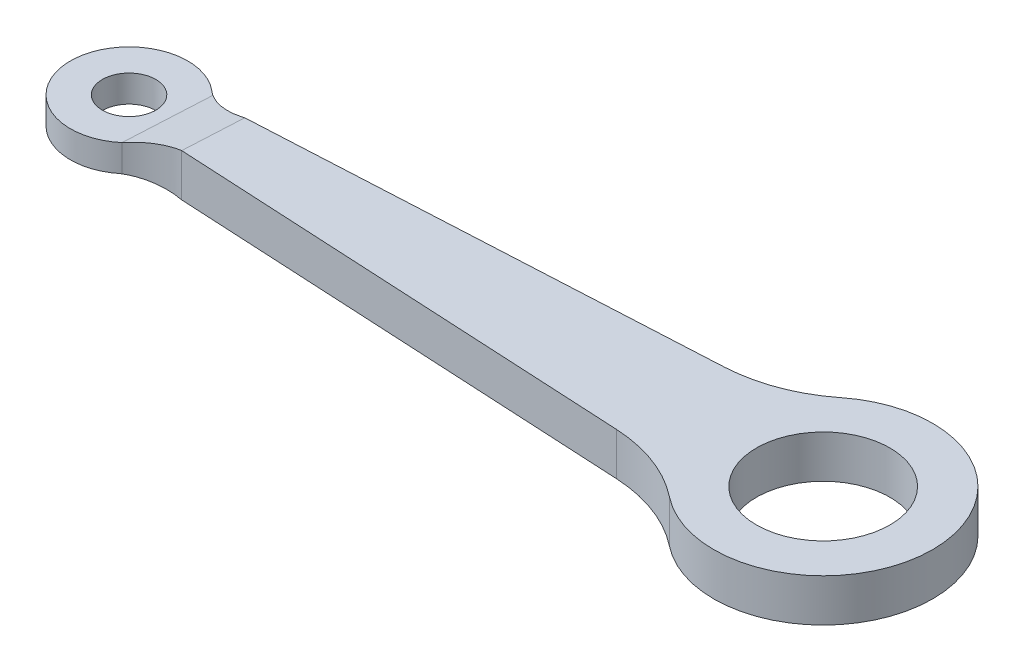
ISO-10303-21;
HEADER;
FILE_DESCRIPTION(('STEP AP214'),'2;1');
FILE_NAME('part.step','',(''),(''),'','','');
FILE_SCHEMA(('AUTOMOTIVE_DESIGN { 1 0 10303 214 1 1 1 1 }'));
ENDSEC;
DATA;
#1=APPLICATION_CONTEXT('core data for automotive mechanical design processes');
#2=APPLICATION_PROTOCOL_DEFINITION('international standard','automotive_design',2000,#1);
#3=PRODUCT_CONTEXT('',#1,'mechanical');
#4=PRODUCT('Part','Part','',(#3));
#5=PRODUCT_RELATED_PRODUCT_CATEGORY('part','',(#4));
#6=PRODUCT_DEFINITION_FORMATION('','',#4);
#7=PRODUCT_DEFINITION_CONTEXT('part definition',#1,'design');
#8=PRODUCT_DEFINITION('design','',#6,#7);
#9=PRODUCT_DEFINITION_SHAPE('','',#8);
#10=(LENGTH_UNIT() NAMED_UNIT(*) SI_UNIT(.MILLI.,.METRE.));
#11=(NAMED_UNIT(*) PLANE_ANGLE_UNIT() SI_UNIT($,.RADIAN.));
#12=(NAMED_UNIT(*) SI_UNIT($,.STERADIAN.) SOLID_ANGLE_UNIT());
#13=UNCERTAINTY_MEASURE_WITH_UNIT(LENGTH_MEASURE(1.E-05),#10,'distance_accuracy_value','');
#14=(GEOMETRIC_REPRESENTATION_CONTEXT(3) GLOBAL_UNCERTAINTY_ASSIGNED_CONTEXT((#13)) GLOBAL_UNIT_ASSIGNED_CONTEXT((#10,
#11,#12)) REPRESENTATION_CONTEXT('',''));
#15=CARTESIAN_POINT('',(0.,0.,0.));
#16=DIRECTION('',(0.,0.,1.));
#17=DIRECTION('',(1.,0.,0.));
#18=AXIS2_PLACEMENT_3D('',#15,#16,#17);
#19=CARTESIAN_POINT('',(4.70734427929749,-1.27,-5.58277852741493));
#20=DIRECTION('',(0.,1.,0.));
#21=DIRECTION('',(0.,0.,1.));
#22=AXIS2_PLACEMENT_3D('',#19,#20,#21);
#23=CYLINDRICAL_SURFACE('',#22,3.81);
#24=CARTESIAN_POINT('',(4.70734427929749,-0.80386674047041,-5.58277852741493));
#25=DIRECTION('',(0.,1.,0.));
#26=DIRECTION('',(-1.,0.,0.));
#27=AXIS2_PLACEMENT_3D('',#24,#25,#26);
#28=CIRCLE('',#27,3.81);
#29=CARTESIAN_POINT('',(2.25133856835967,-0.803866740470411,-2.67002451311149));
#30=VERTEX_POINT('',#29);
#31=CARTESIAN_POINT('',(2.48318629955464,-0.803866740470411,-2.48936273235178));
#32=VERTEX_POINT('',#31);
#33=EDGE_CURVE('E112',#30,#32,#28,.T.);
#34=ORIENTED_EDGE('',*,*,#33,.F.);
#35=DIRECTION('',(0.,1.,0.));
#36=VECTOR('',#35,1.);
#37=CARTESIAN_POINT('',(2.25133856835967,-1.27,-2.67002451311149));
#38=LINE('',#37,#36);
#39=CARTESIAN_POINT('',(2.25133856835967,0.8001,-2.67002451311149));
#40=VERTEX_POINT('',#39);
#41=EDGE_CURVE('E188',#30,#40,#38,.T.);
#42=ORIENTED_EDGE('',*,*,#41,.T.);
#43=CARTESIAN_POINT('',(4.70734427929749,0.8001,-5.58277852741493));
#44=DIRECTION('',(0.,-1.,0.));
#45=DIRECTION('',(0.,0.,-1.));
#46=AXIS2_PLACEMENT_3D('',#43,#44,#45);
#47=CIRCLE('',#46,3.81);
#48=CARTESIAN_POINT('',(2.52034790238095,0.8001,-2.46297935962321));
#49=VERTEX_POINT('',#48);
#50=EDGE_CURVE('E151',#49,#40,#47,.T.);
#51=ORIENTED_EDGE('',*,*,#50,.F.);
#52=CARTESIAN_POINT('',(4.70734427929749,1.16459416058152,-5.58277852741493));
#53=DIRECTION('',(0.177270248452714,-0.984118361070043,0.0092903400543598));
#54=DIRECTION('',(0.982769661058811,0.177513524568729,0.0515047754828398));
#55=AXIS2_PLACEMENT_3D('',#52,#53,#54);
#56=ELLIPSE('',#55,3.87148553539571,3.81);
#57=CARTESIAN_POINT('',(4.90674427258311,1.23643041066993,-1.778));
#58=VERTEX_POINT('',#57);
#59=EDGE_CURVE('E145',#58,#49,#56,.T.);
#60=ORIENTED_EDGE('',*,*,#59,.F.);
#61=DIRECTION('',(0.,1.,0.));
#62=VECTOR('',#61,1.);
#63=CARTESIAN_POINT('',(4.90674427258311,-1.27,-1.778));
#64=LINE('',#63,#62);
#65=CARTESIAN_POINT('',(4.90674427258311,-1.23718437448195,-1.778));
#66=VERTEX_POINT('',#65);
#67=EDGE_CURVE('E131',#66,#58,#64,.T.);
#68=ORIENTED_EDGE('',*,*,#67,.F.);
#69=CARTESIAN_POINT('',(4.70734427929749,-1.16696154695958,-5.58277852741493));
#70=DIRECTION('',(0.173410198874507,0.984807753012208,0.00908804342804351));
#71=DIRECTION('',(-0.983458108213279,0.173648177666931,-0.0515408554693592));
#72=AXIS2_PLACEMENT_3D('',#69,#70,#71);
#73=ELLIPSE('',#72,3.86877539128469,3.81);
#74=EDGE_CURVE('E125',#32,#66,#73,.T.);
#75=ORIENTED_EDGE('',*,*,#74,.F.);
#76=EDGE_LOOP('',(#34,#42,#51,#60,#68,#75));
#77=FACE_BOUND('',#76,.T.);
#78=ADVANCED_FACE('F33',(#77),#23,.F.);
#79=CARTESIAN_POINT('',(4.90674427258311,-1.27,-1.778));
#80=DIRECTION('',(-0.0523359562429444,0.,-0.998629534754574));
#81=DIRECTION('',(-0.998629534754574,0.,0.0523359562429445));
#82=AXIS2_PLACEMENT_3D('',#79,#80,#81);
#83=PLANE('',#82);
#84=DIRECTION('',(0.983620155883233,-0.17272537062674,-0.0515493480278797));
#85=VECTOR('',#84,1.);
#86=CARTESIAN_POINT('',(4.91231952121474,-1.23816339761448,-1.77829218639973));
#87=LINE('',#86,#85);
#88=CARTESIAN_POINT('',(5.09361960288548,-1.27,-1.78779372106393));
#89=VERTEX_POINT('',#88);
#90=EDGE_CURVE('E47',#66,#89,#87,.T.);
#91=ORIENTED_EDGE('',*,*,#90,.F.);
#92=ORIENTED_EDGE('',*,*,#67,.T.);
#93=DIRECTION('',(-0.98293888660826,-0.176571485955933,0.0515136442180846));
#94=VECTOR('',#93,1.);
#95=CARTESIAN_POINT('',(4.47173076753674,1.15828620247609,-1.75520190824239));
#96=LINE('',#95,#94);
#97=CARTESIAN_POINT('',(5.09361960288548,1.27,-1.78779372106393));
#98=VERTEX_POINT('',#97);
#99=EDGE_CURVE('E142',#98,#58,#96,.T.);
#100=ORIENTED_EDGE('',*,*,#99,.F.);
#101=DIRECTION('',(-0.998629534754574,0.,0.0523359562429444));
#102=VECTOR('',#101,1.);
#103=CARTESIAN_POINT('',(4.90674427258311,1.27,-1.778));
#104=LINE('',#103,#102);
#105=CARTESIAN_POINT('',(32.1983894506406,1.27,-3.20829451676273));
#106=VERTEX_POINT('',#105);
#107=EDGE_CURVE('E169',#106,#98,#104,.T.);
#108=ORIENTED_EDGE('',*,*,#107,.F.);
#109=DIRECTION('',(0.,1.,0.));
#110=VECTOR('',#109,1.);
#111=CARTESIAN_POINT('',(32.1983894506406,-1.27,-3.20829451676273));
#112=LINE('',#111,#110);
#113=CARTESIAN_POINT('',(32.1983894506406,-1.27,-3.20829451676273));
#114=VERTEX_POINT('',#113);
#115=EDGE_CURVE('E54',#114,#106,#112,.T.);
#116=ORIENTED_EDGE('',*,*,#115,.F.);
#117=DIRECTION('',(-0.998629534754574,0.,0.0523359562429444));
#118=VECTOR('',#117,1.);
#119=CARTESIAN_POINT('',(4.90674427258311,-1.27,-1.778));
#120=LINE('',#119,#118);
#121=EDGE_CURVE('E186',#114,#89,#120,.T.);
#122=ORIENTED_EDGE('',*,*,#121,.T.);
#123=EDGE_LOOP('',(#91,#92,#100,#108,#116,#122));
#124=FACE_BOUND('',#123,.T.);
#125=ADVANCED_FACE('F230',(#124),#83,.T.);
#126=CARTESIAN_POINT('',(31.7331227996408,-1.27,-12.0861110807309));
#127=DIRECTION('',(0.,1.,0.));
#128=DIRECTION('',(0.,0.,1.));
#129=AXIS2_PLACEMENT_3D('',#126,#127,#128);
#130=CYLINDRICAL_SURFACE('',#129,8.89);
#131=ORIENTED_EDGE('',*,*,#115,.T.);
#132=CARTESIAN_POINT('',(31.7331227996408,1.27,-12.0861110807309));
#133=DIRECTION('',(0.,-1.,0.));
#134=DIRECTION('',(0.,0.,1.));
#135=AXIS2_PLACEMENT_3D('',#132,#133,#134);
#136=CIRCLE('',#135,8.89);
#137=CARTESIAN_POINT('',(37.2418354101575,1.27,-5.10856241556667));
#138=VERTEX_POINT('',#137);
#139=EDGE_CURVE('E166',#138,#106,#136,.T.);
#140=ORIENTED_EDGE('',*,*,#139,.F.);
#141=DIRECTION('',(0.,1.,0.));
#142=VECTOR('',#141,1.);
#143=CARTESIAN_POINT('',(37.2418354101575,-1.27,-5.10856241556667));
#144=LINE('',#143,#142);
#145=CARTESIAN_POINT('',(37.2418354101575,-1.27,-5.10856241556667));
#146=VERTEX_POINT('',#145);
#147=EDGE_CURVE('E191',#146,#138,#144,.T.);
#148=ORIENTED_EDGE('',*,*,#147,.F.);
#149=CARTESIAN_POINT('',(31.7331227996408,-1.27,-12.0861110807309));
#150=DIRECTION('',(0.,-1.,0.));
#151=DIRECTION('',(0.,0.,1.));
#152=AXIS2_PLACEMENT_3D('',#149,#150,#151);
#153=CIRCLE('',#152,8.89);
#154=EDGE_CURVE('E184',#146,#114,#153,.T.);
#155=ORIENTED_EDGE('',*,*,#154,.T.);
#156=EDGE_LOOP('',(#131,#140,#148,#155));
#157=FACE_BOUND('',#156,.T.);
#158=ADVANCED_FACE('F256',(#157),#130,.F.);
#159=CARTESIAN_POINT('',(41.275,-1.27,0.));
#160=DIRECTION('',(0.,1.,0.));
#161=DIRECTION('',(0.,0.,1.));
#162=AXIS2_PLACEMENT_3D('',#159,#160,#161);
#163=CYLINDRICAL_SURFACE('',#162,6.50875);
#164=ORIENTED_EDGE('',*,*,#147,.T.);
#165=CARTESIAN_POINT('',(41.275,1.27,0.));
#166=DIRECTION('',(0.,1.,0.));
#167=DIRECTION('',(0.,0.,1.));
#168=AXIS2_PLACEMENT_3D('',#165,#166,#167);
#169=CIRCLE('',#168,6.50875);
#170=CARTESIAN_POINT('',(37.2418354101575,1.27,5.10856241556666));
#171=VERTEX_POINT('',#170);
#172=EDGE_CURVE('E163',#171,#138,#169,.T.);
#173=ORIENTED_EDGE('',*,*,#172,.F.);
#174=DIRECTION('',(0.,1.,0.));
#175=VECTOR('',#174,1.);
#176=CARTESIAN_POINT('',(37.2418354101575,-1.27,5.10856241556666));
#177=LINE('',#176,#175);
#178=CARTESIAN_POINT('',(37.2418354101575,-1.27,5.10856241556666));
#179=VERTEX_POINT('',#178);
#180=EDGE_CURVE('E193',#179,#171,#177,.T.);
#181=ORIENTED_EDGE('',*,*,#180,.F.);
#182=CARTESIAN_POINT('',(41.275,-1.27,0.));
#183=DIRECTION('',(0.,1.,0.));
#184=DIRECTION('',(0.,0.,1.));
#185=AXIS2_PLACEMENT_3D('',#182,#183,#184);
#186=CIRCLE('',#185,6.50875);
#187=EDGE_CURVE('E181',#179,#146,#186,.T.);
#188=ORIENTED_EDGE('',*,*,#187,.T.);
#189=EDGE_LOOP('',(#164,#173,#181,#188));
#190=FACE_BOUND('',#189,.T.);
#191=ADVANCED_FACE('F261',(#190),#163,.T.);
#192=CARTESIAN_POINT('',(31.7331227996408,-1.27,12.0861110807309));
#193=DIRECTION('',(0.,1.,0.));
#194=DIRECTION('',(0.,0.,1.));
#195=AXIS2_PLACEMENT_3D('',#192,#193,#194);
#196=CYLINDRICAL_SURFACE('',#195,8.89);
#197=ORIENTED_EDGE('',*,*,#180,.T.);
#198=CARTESIAN_POINT('',(31.7331227996408,1.27,12.0861110807309));
#199=DIRECTION('',(0.,-1.,0.));
#200=DIRECTION('',(0.,0.,-1.));
#201=AXIS2_PLACEMENT_3D('',#198,#199,#200);
#202=CIRCLE('',#201,8.89);
#203=CARTESIAN_POINT('',(32.1983894506406,1.27,3.20829451676272));
#204=VERTEX_POINT('',#203);
#205=EDGE_CURVE('E160',#204,#171,#202,.T.);
#206=ORIENTED_EDGE('',*,*,#205,.F.);
#207=DIRECTION('',(0.,1.,0.));
#208=VECTOR('',#207,1.);
#209=CARTESIAN_POINT('',(32.1983894506406,-1.27,3.20829451676272));
#210=LINE('',#209,#208);
#211=CARTESIAN_POINT('',(32.1983894506406,-1.27,3.20829451676272));
#212=VERTEX_POINT('',#211);
#213=EDGE_CURVE('E195',#212,#204,#210,.T.);
#214=ORIENTED_EDGE('',*,*,#213,.F.);
#215=CARTESIAN_POINT('',(31.7331227996408,-1.27,12.0861110807309));
#216=DIRECTION('',(0.,-1.,0.));
#217=DIRECTION('',(0.,0.,-1.));
#218=AXIS2_PLACEMENT_3D('',#215,#216,#217);
#219=CIRCLE('',#218,8.89);
#220=EDGE_CURVE('E178',#212,#179,#219,.T.);
#221=ORIENTED_EDGE('',*,*,#220,.T.);
#222=EDGE_LOOP('',(#197,#206,#214,#221));
#223=FACE_BOUND('',#222,.T.);
#224=ADVANCED_FACE('F267',(#223),#196,.F.);
#225=CARTESIAN_POINT('',(4.90674427258311,-1.27,1.778));
#226=DIRECTION('',(-0.052335956242944,0.,0.998629534754574));
#227=DIRECTION('',(0.998629534754574,0.,0.052335956242944));
#228=AXIS2_PLACEMENT_3D('',#225,#226,#227);
#229=PLANE('',#228);
#230=ORIENTED_EDGE('',*,*,#213,.T.);
#231=DIRECTION('',(0.998629534754574,0.,0.052335956242944));
#232=VECTOR('',#231,1.);
#233=CARTESIAN_POINT('',(4.90674427258311,1.27,1.778));
#234=LINE('',#233,#232);
#235=CARTESIAN_POINT('',(4.90674427258311,1.27,1.778));
#236=VERTEX_POINT('',#235);
#237=EDGE_CURVE('E157',#236,#204,#234,.T.);
#238=ORIENTED_EDGE('',*,*,#237,.F.);
#239=DIRECTION('',(0.,1.,0.));
#240=VECTOR('',#239,1.);
#241=CARTESIAN_POINT('',(4.90674427258311,-1.27,1.778));
#242=LINE('',#241,#240);
#243=CARTESIAN_POINT('',(4.90674427258311,-1.27,1.778));
#244=VERTEX_POINT('',#243);
#245=EDGE_CURVE('E197',#244,#236,#242,.T.);
#246=ORIENTED_EDGE('',*,*,#245,.F.);
#247=DIRECTION('',(0.998629534754574,0.,0.052335956242944));
#248=VECTOR('',#247,1.);
#249=CARTESIAN_POINT('',(4.90674427258311,-1.27,1.778));
#250=LINE('',#249,#248);
#251=EDGE_CURVE('E175',#244,#212,#250,.T.);
#252=ORIENTED_EDGE('',*,*,#251,.T.);
#253=EDGE_LOOP('',(#230,#238,#246,#252));
#254=FACE_BOUND('',#253,.T.);
#255=ADVANCED_FACE('F271',(#254),#229,.T.);
#256=CARTESIAN_POINT('',(4.70734427929749,-1.27,5.58277852741493));
#257=DIRECTION('',(0.,1.,0.));
#258=DIRECTION('',(0.,0.,1.));
#259=AXIS2_PLACEMENT_3D('',#256,#257,#258);
#260=CYLINDRICAL_SURFACE('',#259,3.81);
#261=CARTESIAN_POINT('',(4.70734427929749,-1.27,5.58277852741493));
#262=DIRECTION('',(0.173410198874507,0.984807753012208,0.00908804342804351));
#263=DIRECTION('',(-0.983458108213279,0.173648177666931,-0.0515408554693592));
#264=AXIS2_PLACEMENT_3D('',#261,#262,#263);
#265=ELLIPSE('',#264,3.86877539128469,3.81);
#266=CARTESIAN_POINT('',(2.25133856835967,-0.810653825719585,2.67002451311149));
#267=VERTEX_POINT('',#266);
#268=EDGE_CURVE('E137',#244,#267,#265,.T.);
#269=ORIENTED_EDGE('',*,*,#268,.F.);
#270=ORIENTED_EDGE('',*,*,#245,.T.);
#271=CARTESIAN_POINT('',(4.70734427929749,1.27,5.58277852741493));
#272=DIRECTION('',(0.177270248452714,-0.984118361070043,0.0092903400543598));
#273=DIRECTION('',(0.982769661058811,0.177513524568729,0.0515047754828398));
#274=AXIS2_PLACEMENT_3D('',#271,#272,#273);
#275=ELLIPSE('',#274,3.87148553539571,3.81);
#276=CARTESIAN_POINT('',(2.25133856835967,0.8001,2.67002451311149));
#277=VERTEX_POINT('',#276);
#278=EDGE_CURVE('E135',#277,#236,#275,.T.);
#279=ORIENTED_EDGE('',*,*,#278,.F.);
#280=DIRECTION('',(0.,1.,0.));
#281=VECTOR('',#280,1.);
#282=CARTESIAN_POINT('',(2.25133856835967,-1.27,2.67002451311149));
#283=LINE('',#282,#281);
#284=EDGE_CURVE('E200',#267,#277,#283,.T.);
#285=ORIENTED_EDGE('',*,*,#284,.F.);
#286=EDGE_LOOP('',(#269,#270,#279,#285));
#287=FACE_BOUND('',#286,.T.);
#288=ADVANCED_FACE('F218',(#287),#260,.F.);
#289=CARTESIAN_POINT('',(0.,-1.27,0.));
#290=DIRECTION('',(0.,1.,0.));
#291=DIRECTION('',(0.,0.,1.));
#292=AXIS2_PLACEMENT_3D('',#289,#290,#291);
#293=CYLINDRICAL_SURFACE('',#292,3.4925);
#294=CARTESIAN_POINT('',(0.,-0.803866740470411,0.));
#295=DIRECTION('',(0.,1.,0.));
#296=DIRECTION('',(-1.,0.,0.));
#297=AXIS2_PLACEMENT_3D('',#294,#295,#296);
#298=CIRCLE('',#297,3.4925);
#299=CARTESIAN_POINT('',(2.21104043659627,-0.803866740470411,2.70348967775654));
#300=VERTEX_POINT('',#299);
#301=EDGE_CURVE('E117',#300,#30,#298,.F.);
#302=ORIENTED_EDGE('',*,*,#301,.F.);
#303=CARTESIAN_POINT('',(0.,-0.389586499295871,0.));
#304=DIRECTION('',(0.173410198874507,0.984807753012208,0.00908804342804351));
#305=DIRECTION('',(-0.983458108213279,0.173648177666931,-0.0515408554693592));
#306=AXIS2_PLACEMENT_3D('',#303,#304,#305);
#307=ELLIPSE('',#306,3.54637744201096,3.4925);
#308=EDGE_CURVE('E121',#267,#300,#307,.F.);
#309=ORIENTED_EDGE('',*,*,#308,.F.);
#310=ORIENTED_EDGE('',*,*,#284,.T.);
#311=CARTESIAN_POINT('',(0.,0.8001,0.));
#312=DIRECTION('',(0.,-1.,0.));
#313=DIRECTION('',(0.,0.,-1.));
#314=AXIS2_PLACEMENT_3D('',#311,#312,#313);
#315=CIRCLE('',#314,3.4925);
#316=EDGE_CURVE('E148',#40,#277,#315,.F.);
#317=ORIENTED_EDGE('',*,*,#316,.F.);
#318=ORIENTED_EDGE('',*,*,#41,.F.);
#319=EDGE_LOOP('',(#302,#309,#310,#317,#318));
#320=FACE_BOUND('',#319,.T.);
#321=ADVANCED_FACE('F215',(#320),#293,.T.);
#322=CARTESIAN_POINT('',(4.70734427929749,-1.27,-5.58277852741493));
#323=DIRECTION('',(0.,1.,0.));
#324=DIRECTION('',(0.,0.,1.));
#325=AXIS2_PLACEMENT_3D('',#322,#323,#324);
#326=PLANE('',#325);
#327=CARTESIAN_POINT('',(41.275,-1.27,0.));
#328=DIRECTION('',(0.,1.,0.));
#329=DIRECTION('',(0.,0.,1.));
#330=AXIS2_PLACEMENT_3D('',#327,#328,#329);
#331=CIRCLE('',#330,3.96875000000004);
#332=CARTESIAN_POINT('',(41.275,-1.27,3.96875000000004));
#333=VERTEX_POINT('',#332);
#334=EDGE_CURVE('E172',#333,#333,#331,.T.);
#335=ORIENTED_EDGE('',*,*,#334,.T.);
#336=EDGE_LOOP('',(#335));
#337=FACE_BOUND('',#336,.T.);
#338=ORIENTED_EDGE('',*,*,#251,.F.);
#339=DIRECTION('',(0.0523359562429442,0.,-0.998629534754574));
#340=VECTOR('',#339,1.);
#341=CARTESIAN_POINT('',(5.29090353953183,-1.27,-5.55219548250599));
#342=LINE('',#341,#340);
#343=EDGE_CURVE('E11',#244,#89,#342,.T.);
#344=ORIENTED_EDGE('',*,*,#343,.T.);
#345=ORIENTED_EDGE('',*,*,#121,.F.);
#346=ORIENTED_EDGE('',*,*,#154,.F.);
#347=ORIENTED_EDGE('',*,*,#187,.F.);
#348=ORIENTED_EDGE('',*,*,#220,.F.);
#349=EDGE_LOOP('',(#338,#344,#345,#346,#347,#348));
#350=FACE_BOUND('',#349,.T.);
#351=ADVANCED_FACE('F242',(#337,#350),#326,.F.);
#352=CARTESIAN_POINT('',(0.,-1.27,0.));
#353=DIRECTION('',(0.,1.,0.));
#354=DIRECTION('',(0.,0.,1.));
#355=AXIS2_PLACEMENT_3D('',#352,#353,#354);
#356=CYLINDRICAL_SURFACE('',#355,1.5875);
#357=CARTESIAN_POINT('',(0.,-0.803866740470411,0.));
#358=DIRECTION('',(0.,1.,0.));
#359=DIRECTION('',(-1.,0.,0.));
#360=AXIS2_PLACEMENT_3D('',#357,#358,#359);
#361=CIRCLE('',#360,1.5875);
#362=CARTESIAN_POINT('',(-1.5875,-0.803866740470411,0.));
#363=VERTEX_POINT('',#362);
#364=EDGE_CURVE('E127',#363,#363,#361,.F.);
#365=ORIENTED_EDGE('',*,*,#364,.T.);
#366=EDGE_LOOP('',(#365));
#367=FACE_BOUND('',#366,.T.);
#368=CARTESIAN_POINT('',(0.,0.8001,0.));
#369=DIRECTION('',(0.,-1.,0.));
#370=DIRECTION('',(0.,0.,-1.));
#371=AXIS2_PLACEMENT_3D('',#368,#369,#370);
#372=CIRCLE('',#371,1.5875);
#373=CARTESIAN_POINT('',(0.,0.8001,-1.5875));
#374=VERTEX_POINT('',#373);
#375=EDGE_CURVE('E147',#374,#374,#372,.F.);
#376=ORIENTED_EDGE('',*,*,#375,.T.);
#377=EDGE_LOOP('',(#376));
#378=FACE_BOUND('',#377,.T.);
#379=ADVANCED_FACE('F239',(#367,#378),#356,.F.);
#380=CARTESIAN_POINT('',(41.275,-1.27,0.));
#381=DIRECTION('',(0.,1.,0.));
#382=DIRECTION('',(0.,0.,1.));
#383=AXIS2_PLACEMENT_3D('',#380,#381,#382);
#384=CYLINDRICAL_SURFACE('',#383,3.96875000000004);
#385=ORIENTED_EDGE('',*,*,#334,.F.);
#386=EDGE_LOOP('',(#385));
#387=FACE_BOUND('',#386,.T.);
#388=CARTESIAN_POINT('',(41.275,1.27,0.));
#389=DIRECTION('',(0.,1.,0.));
#390=DIRECTION('',(0.,0.,1.));
#391=AXIS2_PLACEMENT_3D('',#388,#389,#390);
#392=CIRCLE('',#391,3.96875000000004);
#393=CARTESIAN_POINT('',(41.275,1.27,3.96875000000004));
#394=VERTEX_POINT('',#393);
#395=EDGE_CURVE('E154',#394,#394,#392,.T.);
#396=ORIENTED_EDGE('',*,*,#395,.T.);
#397=EDGE_LOOP('',(#396));
#398=FACE_BOUND('',#397,.T.);
#399=ADVANCED_FACE('F241',(#387,#398),#384,.F.);
#400=CARTESIAN_POINT('',(4.70734427929749,1.27,-5.58277852741493));
#401=DIRECTION('',(0.,1.,0.));
#402=DIRECTION('',(0.,0.,1.));
#403=AXIS2_PLACEMENT_3D('',#400,#401,#402);
#404=PLANE('',#403);
#405=DIRECTION('',(0.0523359562429443,0.,-0.998629534754574));
#406=VECTOR('',#405,1.);
#407=CARTESIAN_POINT('',(5.29090353953183,1.27,-5.55219548250599));
#408=LINE('',#407,#406);
#409=EDGE_CURVE('E40',#236,#98,#408,.T.);
#410=ORIENTED_EDGE('',*,*,#409,.F.);
#411=ORIENTED_EDGE('',*,*,#237,.T.);
#412=ORIENTED_EDGE('',*,*,#205,.T.);
#413=ORIENTED_EDGE('',*,*,#172,.T.);
#414=ORIENTED_EDGE('',*,*,#139,.T.);
#415=ORIENTED_EDGE('',*,*,#107,.T.);
#416=EDGE_LOOP('',(#410,#411,#412,#413,#414,#415));
#417=FACE_BOUND('',#416,.T.);
#418=ORIENTED_EDGE('',*,*,#395,.F.);
#419=EDGE_LOOP('',(#418));
#420=FACE_BOUND('',#419,.T.);
#421=ADVANCED_FACE('F226',(#417,#420),#404,.T.);
#422=CARTESIAN_POINT('',(-3.01665664138554,0.8001,-9.17108649875049));
#423=DIRECTION('',(0.,-1.,0.));
#424=DIRECTION('',(0.,0.,-1.));
#425=AXIS2_PLACEMENT_3D('',#422,#423,#424);
#426=PLANE('',#425);
#427=ORIENTED_EDGE('',*,*,#50,.T.);
#428=ORIENTED_EDGE('',*,*,#316,.T.);
#429=DIRECTION('',(-0.0523359562429443,0.,0.998629534754574));
#430=VECTOR('',#429,1.);
#431=CARTESIAN_POINT('',(2.85577582260628,0.8001,-8.86332535432304));
#432=LINE('',#431,#430);
#433=EDGE_CURVE('E132',#49,#277,#432,.T.);
#434=ORIENTED_EDGE('',*,*,#433,.F.);
#435=EDGE_LOOP('',(#427,#428,#434));
#436=FACE_BOUND('',#435,.T.);
#437=ORIENTED_EDGE('',*,*,#375,.F.);
#438=EDGE_LOOP('',(#437));
#439=FACE_BOUND('',#438,.T.);
#440=ADVANCED_FACE('F233',(#436,#439),#426,.F.);
#441=CARTESIAN_POINT('',(2.85577582260628,0.8001,-8.86332535432304));
#442=DIRECTION('',(0.177270248452714,-0.984118361070043,0.0092903400543598));
#443=DIRECTION('',(0.984160833653145,0.177277899082615,0.));
#444=AXIS2_PLACEMENT_3D('',#441,#442,#443);
#445=PLANE('',#444);
#446=ORIENTED_EDGE('',*,*,#59,.T.);
#447=ORIENTED_EDGE('',*,*,#433,.T.);
#448=ORIENTED_EDGE('',*,*,#278,.T.);
#449=ORIENTED_EDGE('',*,*,#409,.T.);
#450=ORIENTED_EDGE('',*,*,#99,.T.);
#451=EDGE_LOOP('',(#446,#447,#448,#449,#450));
#452=FACE_BOUND('',#451,.T.);
#453=ADVANCED_FACE('F222',(#452),#445,.F.);
#454=CARTESIAN_POINT('',(2.81733710065068,-0.803866740470411,-8.86533984237921));
#455=DIRECTION('',(0.,1.,0.));
#456=DIRECTION('',(-1.,0.,0.));
#457=AXIS2_PLACEMENT_3D('',#454,#455,#456);
#458=PLANE('',#457);
#459=ORIENTED_EDGE('',*,*,#33,.T.);
#460=DIRECTION('',(-0.0523359562429443,0.,0.998629534754574));
#461=VECTOR('',#460,1.);
#462=CARTESIAN_POINT('',(2.81733710065068,-0.803866740470411,-8.86533984237921));
#463=LINE('',#462,#461);
#464=EDGE_CURVE('E116',#32,#300,#463,.T.);
#465=ORIENTED_EDGE('',*,*,#464,.T.);
#466=ORIENTED_EDGE('',*,*,#301,.T.);
#467=EDGE_LOOP('',(#459,#465,#466));
#468=FACE_BOUND('',#467,.T.);
#469=ORIENTED_EDGE('',*,*,#364,.F.);
#470=EDGE_LOOP('',(#469));
#471=FACE_BOUND('',#470,.T.);
#472=ADVANCED_FACE('F114',(#468,#471),#458,.F.);
#473=CARTESIAN_POINT('',(5.4572872559097,-1.27,-8.72698591732417));
#474=DIRECTION('',(0.173410198874507,0.984807753012208,0.00908804342804351));
#475=DIRECTION('',(-0.984848424415183,0.17341736051195,0.));
#476=AXIS2_PLACEMENT_3D('',#473,#474,#475);
#477=PLANE('',#476);
#478=ORIENTED_EDGE('',*,*,#74,.T.);
#479=ORIENTED_EDGE('',*,*,#90,.T.);
#480=ORIENTED_EDGE('',*,*,#343,.F.);
#481=ORIENTED_EDGE('',*,*,#268,.T.);
#482=ORIENTED_EDGE('',*,*,#308,.T.);
#483=ORIENTED_EDGE('',*,*,#464,.F.);
#484=EDGE_LOOP('',(#478,#479,#480,#481,#482,#483));
#485=FACE_BOUND('',#484,.T.);
#486=ADVANCED_FACE('F124',(#485),#477,.F.);
#487=CLOSED_SHELL('',(#78,#125,#158,#191,#224,#255,#288,#321,#351,#379,#399,#421,#440,#453,#472,#486));
#488=MANIFOLD_SOLID_BREP('B2',#487);
#489=ADVANCED_BREP_SHAPE_REPRESENTATION('',(#18,#488),#14);
#490=SHAPE_DEFINITION_REPRESENTATION(#9,#489);
ENDSEC;
END-ISO-10303-21;
